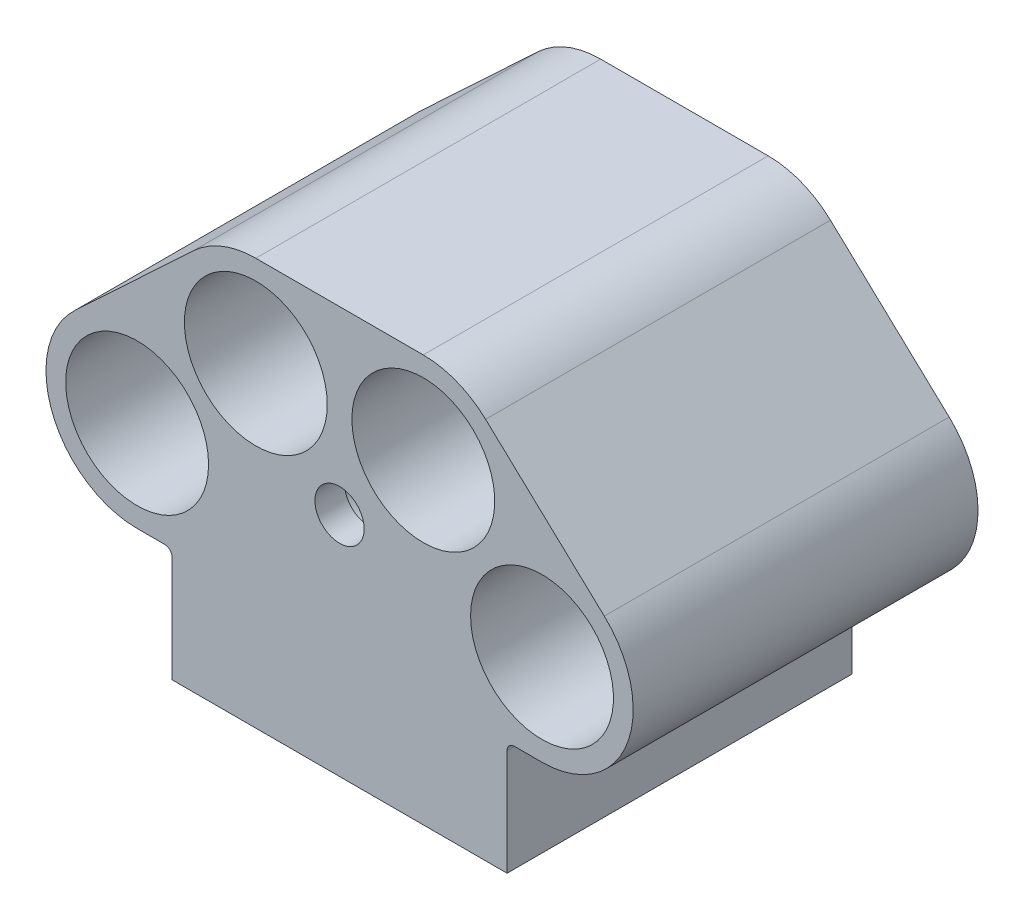
ISO-10303-21;
HEADER;
FILE_DESCRIPTION(('STEP AP214'),'2;1');
FILE_NAME('part.step','',(''),(''),'','','');
FILE_SCHEMA(('AUTOMOTIVE_DESIGN { 1 0 10303 214 1 1 1 1 }'));
ENDSEC;
DATA;
#1=APPLICATION_CONTEXT('core data for automotive mechanical design processes');
#2=APPLICATION_PROTOCOL_DEFINITION('international standard','automotive_design',2000,#1);
#3=PRODUCT_CONTEXT('',#1,'mechanical');
#4=PRODUCT('Part','Part','',(#3));
#5=PRODUCT_RELATED_PRODUCT_CATEGORY('part','',(#4));
#6=PRODUCT_DEFINITION_FORMATION('','',#4);
#7=PRODUCT_DEFINITION_CONTEXT('part definition',#1,'design');
#8=PRODUCT_DEFINITION('design','',#6,#7);
#9=PRODUCT_DEFINITION_SHAPE('','',#8);
#10=(LENGTH_UNIT() NAMED_UNIT(*) SI_UNIT(.MILLI.,.METRE.));
#11=(NAMED_UNIT(*) PLANE_ANGLE_UNIT() SI_UNIT($,.RADIAN.));
#12=(NAMED_UNIT(*) SI_UNIT($,.STERADIAN.) SOLID_ANGLE_UNIT());
#13=UNCERTAINTY_MEASURE_WITH_UNIT(LENGTH_MEASURE(1.E-05),#10,'distance_accuracy_value','');
#14=(GEOMETRIC_REPRESENTATION_CONTEXT(3) GLOBAL_UNCERTAINTY_ASSIGNED_CONTEXT((#13)) GLOBAL_UNIT_ASSIGNED_CONTEXT((#10,
#11,#12)) REPRESENTATION_CONTEXT('',''));
#15=CARTESIAN_POINT('',(0.,0.,0.));
#16=DIRECTION('',(0.,0.,1.));
#17=DIRECTION('',(1.,0.,0.));
#18=AXIS2_PLACEMENT_3D('',#15,#16,#17);
#19=CARTESIAN_POINT('',(0.,21.,17.5));
#20=DIRECTION('',(0.,0.,-1.));
#21=DIRECTION('',(-1.,0.,0.));
#22=AXIS2_PLACEMENT_3D('',#19,#20,#21);
#23=CYLINDRICAL_SURFACE('',#22,2.5);
#24=CARTESIAN_POINT('',(0.,21.,14.5));
#25=DIRECTION('',(0.,0.,1.));
#26=DIRECTION('',(1.,0.,0.));
#27=AXIS2_PLACEMENT_3D('',#24,#25,#26);
#28=CIRCLE('',#27,2.5);
#29=CARTESIAN_POINT('',(2.5,21.,14.5));
#30=VERTEX_POINT('',#29);
#31=EDGE_CURVE('E47',#30,#30,#28,.F.);
#32=ORIENTED_EDGE('',*,*,#31,.T.);
#33=EDGE_LOOP('',(#32));
#34=FACE_BOUND('',#33,.T.);
#35=CARTESIAN_POINT('',(0.,21.,17.5));
#36=DIRECTION('',(0.,0.,-1.));
#37=DIRECTION('',(-1.,0.,0.));
#38=AXIS2_PLACEMENT_3D('',#35,#36,#37);
#39=CIRCLE('',#38,2.5);
#40=CARTESIAN_POINT('',(-2.5,21.,17.5));
#41=VERTEX_POINT('',#40);
#42=EDGE_CURVE('E223',#41,#41,#39,.T.);
#43=ORIENTED_EDGE('',*,*,#42,.F.);
#44=EDGE_LOOP('',(#43));
#45=FACE_BOUND('',#44,.T.);
#46=ADVANCED_FACE('F43',(#34,#45),#23,.F.);
#47=CARTESIAN_POINT('',(-20.5457096935437,18.7783967620276,17.5));
#48=DIRECTION('',(0.,0.,-1.));
#49=DIRECTION('',(-1.,0.,0.));
#50=AXIS2_PLACEMENT_3D('',#47,#48,#49);
#51=CYLINDRICAL_SURFACE('',#50,9.25);
#52=CARTESIAN_POINT('',(-20.5457096935437,18.7783967620276,-17.5));
#53=DIRECTION('',(0.,0.,1.));
#54=DIRECTION('',(1.,0.,0.));
#55=AXIS2_PLACEMENT_3D('',#52,#53,#54);
#56=CIRCLE('',#55,9.25);
#57=CARTESIAN_POINT('',(-20.5457096935437,9.52839676202764,-17.5));
#58=VERTEX_POINT('',#57);
#59=CARTESIAN_POINT('',(-26.8671707993832,25.5312946205294,-17.5));
#60=VERTEX_POINT('',#59);
#61=EDGE_CURVE('E156',#58,#60,#56,.F.);
#62=ORIENTED_EDGE('',*,*,#61,.F.);
#63=DIRECTION('',(0.,0.,-1.));
#64=VECTOR('',#63,1.);
#65=CARTESIAN_POINT('',(-20.5457096935437,9.52839676202764,17.5));
#66=LINE('',#65,#64);
#67=CARTESIAN_POINT('',(-20.5457096935437,9.52839676202764,17.5));
#68=VERTEX_POINT('',#67);
#69=EDGE_CURVE('E12',#68,#58,#66,.T.);
#70=ORIENTED_EDGE('',*,*,#69,.F.);
#71=CARTESIAN_POINT('',(-20.5457096935437,18.7783967620276,17.5));
#72=DIRECTION('',(0.,0.,1.));
#73=DIRECTION('',(1.,0.,0.));
#74=AXIS2_PLACEMENT_3D('',#71,#72,#73);
#75=CIRCLE('',#74,9.25);
#76=CARTESIAN_POINT('',(-26.8671707993832,25.5312946205294,17.5));
#77=VERTEX_POINT('',#76);
#78=EDGE_CURVE('E190',#68,#77,#75,.F.);
#79=ORIENTED_EDGE('',*,*,#78,.T.);
#80=DIRECTION('',(0.,0.,-1.));
#81=VECTOR('',#80,1.);
#82=CARTESIAN_POINT('',(-26.8671707993832,25.5312946205294,17.5));
#83=LINE('',#82,#81);
#84=EDGE_CURVE('E63',#77,#60,#83,.T.);
#85=ORIENTED_EDGE('',*,*,#84,.T.);
#86=EDGE_LOOP('',(#62,#70,#79,#85));
#87=FACE_BOUND('',#86,.T.);
#88=ADVANCED_FACE('F45',(#87),#51,.T.);
#89=CARTESIAN_POINT('',(0.,9.52839676202764,17.5));
#90=DIRECTION('',(0.,1.,0.));
#91=DIRECTION('',(0.,0.,1.));
#92=AXIS2_PLACEMENT_3D('',#89,#90,#91);
#93=PLANE('',#92);
#94=DIRECTION('',(1.,0.,0.));
#95=VECTOR('',#94,1.);
#96=CARTESIAN_POINT('',(0.,9.52839676202764,-17.5));
#97=LINE('',#96,#95);
#98=CARTESIAN_POINT('',(-17.75,9.52839676202764,-17.5));
#99=VERTEX_POINT('',#98);
#100=EDGE_CURVE('E159',#58,#99,#97,.T.);
#101=ORIENTED_EDGE('',*,*,#100,.T.);
#102=DIRECTION('',(0.,0.,-1.));
#103=VECTOR('',#102,1.);
#104=CARTESIAN_POINT('',(-17.75,9.52839676202764,17.5));
#105=LINE('',#104,#103);
#106=CARTESIAN_POINT('',(-17.75,9.52839676202764,17.5));
#107=VERTEX_POINT('',#106);
#108=EDGE_CURVE('E54',#107,#99,#105,.T.);
#109=ORIENTED_EDGE('',*,*,#108,.F.);
#110=DIRECTION('',(1.,0.,0.));
#111=VECTOR('',#110,1.);
#112=CARTESIAN_POINT('',(0.,9.52839676202764,17.5));
#113=LINE('',#112,#111);
#114=EDGE_CURVE('E319',#68,#107,#113,.T.);
#115=ORIENTED_EDGE('',*,*,#114,.F.);
#116=ORIENTED_EDGE('',*,*,#69,.T.);
#117=EDGE_LOOP('',(#101,#109,#115,#116));
#118=FACE_BOUND('',#117,.T.);
#119=ADVANCED_FACE('F412',(#118),#93,.F.);
#120=CARTESIAN_POINT('',(-17.75,8.77839676202764,17.5));
#121=DIRECTION('',(0.,0.,-1.));
#122=DIRECTION('',(-1.,0.,0.));
#123=AXIS2_PLACEMENT_3D('',#120,#121,#122);
#124=CYLINDRICAL_SURFACE('',#123,0.750000000000001);
#125=CARTESIAN_POINT('',(-17.75,8.77839676202764,-17.5));
#126=DIRECTION('',(0.,0.,1.));
#127=DIRECTION('',(1.,0.,0.));
#128=AXIS2_PLACEMENT_3D('',#125,#126,#127);
#129=CIRCLE('',#128,0.750000000000001);
#130=CARTESIAN_POINT('',(-17.,8.77839676202764,-17.5));
#131=VERTEX_POINT('',#130);
#132=EDGE_CURVE('E163',#99,#131,#129,.F.);
#133=ORIENTED_EDGE('',*,*,#132,.T.);
#134=DIRECTION('',(0.,0.,-1.));
#135=VECTOR('',#134,1.);
#136=CARTESIAN_POINT('',(-17.,8.77839676202764,17.5));
#137=LINE('',#136,#135);
#138=CARTESIAN_POINT('',(-17.,8.77839676202764,17.5));
#139=VERTEX_POINT('',#138);
#140=EDGE_CURVE('E198',#139,#131,#137,.T.);
#141=ORIENTED_EDGE('',*,*,#140,.F.);
#142=CARTESIAN_POINT('',(-17.75,8.77839676202764,17.5));
#143=DIRECTION('',(0.,0.,1.));
#144=DIRECTION('',(1.,0.,0.));
#145=AXIS2_PLACEMENT_3D('',#142,#143,#144);
#146=CIRCLE('',#145,0.750000000000001);
#147=EDGE_CURVE('E322',#107,#139,#146,.F.);
#148=ORIENTED_EDGE('',*,*,#147,.F.);
#149=ORIENTED_EDGE('',*,*,#108,.T.);
#150=EDGE_LOOP('',(#133,#141,#148,#149));
#151=FACE_BOUND('',#150,.T.);
#152=ADVANCED_FACE('F606',(#151),#124,.F.);
#153=CARTESIAN_POINT('',(-17.,0.,17.5));
#154=DIRECTION('',(1.,0.,0.));
#155=DIRECTION('',(0.,0.,-1.));
#156=AXIS2_PLACEMENT_3D('',#153,#154,#155);
#157=PLANE('',#156);
#158=DIRECTION('',(0.,-1.,0.));
#159=VECTOR('',#158,1.);
#160=CARTESIAN_POINT('',(-17.,0.,-17.5));
#161=LINE('',#160,#159);
#162=CARTESIAN_POINT('',(-17.,-2.,-17.5));
#163=VERTEX_POINT('',#162);
#164=EDGE_CURVE('E166',#131,#163,#161,.T.);
#165=ORIENTED_EDGE('',*,*,#164,.T.);
#166=DIRECTION('',(0.,0.,-1.));
#167=VECTOR('',#166,1.);
#168=CARTESIAN_POINT('',(-17.,-2.,17.5));
#169=LINE('',#168,#167);
#170=CARTESIAN_POINT('',(-17.,-2.,17.5));
#171=VERTEX_POINT('',#170);
#172=EDGE_CURVE('E124',#171,#163,#169,.T.);
#173=ORIENTED_EDGE('',*,*,#172,.F.);
#174=DIRECTION('',(0.,-1.,0.));
#175=VECTOR('',#174,1.);
#176=CARTESIAN_POINT('',(-17.,0.,17.5));
#177=LINE('',#176,#175);
#178=EDGE_CURVE('E325',#139,#171,#177,.T.);
#179=ORIENTED_EDGE('',*,*,#178,.F.);
#180=ORIENTED_EDGE('',*,*,#140,.T.);
#181=EDGE_LOOP('',(#165,#173,#179,#180));
#182=FACE_BOUND('',#181,.T.);
#183=ADVANCED_FACE('F574',(#182),#157,.F.);
#184=CARTESIAN_POINT('',(0.,-2.,17.5));
#185=DIRECTION('',(0.,1.,0.));
#186=DIRECTION('',(0.,0.,1.));
#187=AXIS2_PLACEMENT_3D('',#184,#185,#186);
#188=PLANE('',#187);
#189=DIRECTION('',(1.,0.,0.));
#190=VECTOR('',#189,1.);
#191=CARTESIAN_POINT('',(0.,-2.,-17.5));
#192=LINE('',#191,#190);
#193=CARTESIAN_POINT('',(17.,-2.,-17.5));
#194=VERTEX_POINT('',#193);
#195=EDGE_CURVE('E169',#163,#194,#192,.T.);
#196=ORIENTED_EDGE('',*,*,#195,.T.);
#197=DIRECTION('',(0.,0.,-1.));
#198=VECTOR('',#197,1.);
#199=CARTESIAN_POINT('',(17.,-2.,17.5));
#200=LINE('',#199,#198);
#201=CARTESIAN_POINT('',(17.,-2.,17.5));
#202=VERTEX_POINT('',#201);
#203=EDGE_CURVE('E303',#202,#194,#200,.T.);
#204=ORIENTED_EDGE('',*,*,#203,.F.);
#205=DIRECTION('',(1.,0.,0.));
#206=VECTOR('',#205,1.);
#207=CARTESIAN_POINT('',(0.,-2.,17.5));
#208=LINE('',#207,#206);
#209=EDGE_CURVE('E138',#171,#202,#208,.T.);
#210=ORIENTED_EDGE('',*,*,#209,.F.);
#211=ORIENTED_EDGE('',*,*,#172,.T.);
#212=EDGE_LOOP('',(#196,#204,#210,#211));
#213=FACE_BOUND('',#212,.T.);
#214=ADVANCED_FACE('F339',(#213),#188,.F.);
#215=CARTESIAN_POINT('',(0.,39.3045165724442,17.5));
#216=DIRECTION('',(0.,1.,0.));
#217=DIRECTION('',(0.,0.,1.));
#218=AXIS2_PLACEMENT_3D('',#215,#216,#217);
#219=PLANE('',#218);
#220=DIRECTION('',(1.,0.,0.));
#221=VECTOR('',#220,1.);
#222=CARTESIAN_POINT('',(0.,39.3045165724442,-17.5));
#223=LINE('',#222,#221);
#224=CARTESIAN_POINT('',(-8.5,39.3045165724442,-17.5));
#225=VERTEX_POINT('',#224);
#226=CARTESIAN_POINT('',(8.5,39.3045165724442,-17.5));
#227=VERTEX_POINT('',#226);
#228=EDGE_CURVE('E119',#225,#227,#223,.T.);
#229=ORIENTED_EDGE('',*,*,#228,.F.);
#230=DIRECTION('',(0.,0.,-1.));
#231=VECTOR('',#230,1.);
#232=CARTESIAN_POINT('',(-8.5,39.3045165724442,17.5));
#233=LINE('',#232,#231);
#234=CARTESIAN_POINT('',(-8.5,39.3045165724442,17.5));
#235=VERTEX_POINT('',#234);
#236=EDGE_CURVE('E111',#235,#225,#233,.T.);
#237=ORIENTED_EDGE('',*,*,#236,.F.);
#238=DIRECTION('',(1.,0.,0.));
#239=VECTOR('',#238,1.);
#240=CARTESIAN_POINT('',(0.,39.3045165724442,17.5));
#241=LINE('',#240,#239);
#242=CARTESIAN_POINT('',(8.5,39.3045165724442,17.5));
#243=VERTEX_POINT('',#242);
#244=EDGE_CURVE('E116',#235,#243,#241,.T.);
#245=ORIENTED_EDGE('',*,*,#244,.T.);
#246=DIRECTION('',(0.,0.,-1.));
#247=VECTOR('',#246,1.);
#248=CARTESIAN_POINT('',(8.5,39.3045165724442,17.5));
#249=LINE('',#248,#247);
#250=EDGE_CURVE('E307',#243,#227,#249,.T.);
#251=ORIENTED_EDGE('',*,*,#250,.T.);
#252=EDGE_LOOP('',(#229,#237,#245,#251));
#253=FACE_BOUND('',#252,.T.);
#254=ADVANCED_FACE('F113',(#253),#219,.T.);
#255=CARTESIAN_POINT('',(-8.5,30.0545165724442,17.5));
#256=DIRECTION('',(0.,0.,-1.));
#257=DIRECTION('',(-1.,0.,0.));
#258=AXIS2_PLACEMENT_3D('',#255,#256,#257);
#259=CYLINDRICAL_SURFACE('',#258,9.25);
#260=CARTESIAN_POINT('',(-8.5,30.0545165724442,-17.5));
#261=DIRECTION('',(0.,0.,1.));
#262=DIRECTION('',(1.,0.,0.));
#263=AXIS2_PLACEMENT_3D('',#260,#261,#262);
#264=CIRCLE('',#263,9.25);
#265=CARTESIAN_POINT('',(-14.8214611058396,36.8074144309459,-17.5));
#266=VERTEX_POINT('',#265);
#267=EDGE_CURVE('E175',#266,#225,#264,.F.);
#268=ORIENTED_EDGE('',*,*,#267,.F.);
#269=DIRECTION('',(0.,0.,-1.));
#270=VECTOR('',#269,1.);
#271=CARTESIAN_POINT('',(-14.8214611058396,36.8074144309459,17.5));
#272=LINE('',#271,#270);
#273=CARTESIAN_POINT('',(-14.8214611058396,36.8074144309459,17.5));
#274=VERTEX_POINT('',#273);
#275=EDGE_CURVE('E86',#274,#266,#272,.T.);
#276=ORIENTED_EDGE('',*,*,#275,.F.);
#277=CARTESIAN_POINT('',(-8.5,30.0545165724442,17.5));
#278=DIRECTION('',(0.,0.,1.));
#279=DIRECTION('',(1.,0.,0.));
#280=AXIS2_PLACEMENT_3D('',#277,#278,#279);
#281=CIRCLE('',#280,9.25);
#282=EDGE_CURVE('E132',#274,#235,#281,.F.);
#283=ORIENTED_EDGE('',*,*,#282,.T.);
#284=ORIENTED_EDGE('',*,*,#236,.T.);
#285=EDGE_LOOP('',(#268,#276,#283,#284));
#286=FACE_BOUND('',#285,.T.);
#287=ADVANCED_FACE('F140',(#286),#259,.T.);
#288=CARTESIAN_POINT('',(-8.5,30.0545165724442,17.5));
#289=DIRECTION('',(0.,0.,-1.));
#290=DIRECTION('',(-1.,0.,0.));
#291=AXIS2_PLACEMENT_3D('',#288,#289,#290);
#292=CYLINDRICAL_SURFACE('',#291,7.25);
#293=CARTESIAN_POINT('',(-8.5,30.0545165724442,17.5));
#294=DIRECTION('',(0.,0.,1.));
#295=DIRECTION('',(1.,0.,0.));
#296=AXIS2_PLACEMENT_3D('',#293,#294,#295);
#297=CIRCLE('',#296,7.25);
#298=CARTESIAN_POINT('',(-1.25,30.0545165724442,17.5));
#299=VERTEX_POINT('',#298);
#300=EDGE_CURVE('E145',#299,#299,#297,.T.);
#301=ORIENTED_EDGE('',*,*,#300,.T.);
#302=EDGE_LOOP('',(#301));
#303=FACE_BOUND('',#302,.T.);
#304=CARTESIAN_POINT('',(-8.5,30.0545165724442,-17.5));
#305=DIRECTION('',(0.,0.,1.));
#306=DIRECTION('',(1.,0.,0.));
#307=AXIS2_PLACEMENT_3D('',#304,#305,#306);
#308=CIRCLE('',#307,7.25);
#309=CARTESIAN_POINT('',(-1.25,30.0545165724442,-17.5));
#310=VERTEX_POINT('',#309);
#311=EDGE_CURVE('E182',#310,#310,#308,.T.);
#312=ORIENTED_EDGE('',*,*,#311,.F.);
#313=EDGE_LOOP('',(#312));
#314=FACE_BOUND('',#313,.T.);
#315=ADVANCED_FACE('F394',(#303,#314),#292,.F.);
#316=CARTESIAN_POINT('',(-25.2858444233583,27.011591434007,17.5));
#317=DIRECTION('',(-0.683401200631305,0.730043011729919,0.));
#318=DIRECTION('',(-0.730043011729919,-0.683401200631305,0.));
#319=AXIS2_PLACEMENT_3D('',#316,#317,#318);
#320=PLANE('',#319);
#321=DIRECTION('',(0.730043011729919,0.683401200631305,0.));
#322=VECTOR('',#321,1.);
#323=CARTESIAN_POINT('',(-25.2858444233583,27.011591434007,-17.5));
#324=LINE('',#323,#322);
#325=EDGE_CURVE('E178',#60,#266,#324,.T.);
#326=ORIENTED_EDGE('',*,*,#325,.F.);
#327=ORIENTED_EDGE('',*,*,#84,.F.);
#328=DIRECTION('',(0.730043011729919,0.683401200631305,0.));
#329=VECTOR('',#328,1.);
#330=CARTESIAN_POINT('',(-25.2858444233583,27.011591434007,17.5));
#331=LINE('',#330,#329);
#332=EDGE_CURVE('E142',#77,#274,#331,.T.);
#333=ORIENTED_EDGE('',*,*,#332,.T.);
#334=ORIENTED_EDGE('',*,*,#275,.T.);
#335=EDGE_LOOP('',(#326,#327,#333,#334));
#336=FACE_BOUND('',#335,.T.);
#337=ADVANCED_FACE('F391',(#336),#320,.T.);
#338=CARTESIAN_POINT('',(-20.5457096935437,18.7783967620276,17.5));
#339=DIRECTION('',(0.,0.,-1.));
#340=DIRECTION('',(-1.,0.,0.));
#341=AXIS2_PLACEMENT_3D('',#338,#339,#340);
#342=CYLINDRICAL_SURFACE('',#341,7.25);
#343=CARTESIAN_POINT('',(-20.5457096935437,18.7783967620276,17.5));
#344=DIRECTION('',(0.,0.,1.));
#345=DIRECTION('',(1.,0.,0.));
#346=AXIS2_PLACEMENT_3D('',#343,#344,#345);
#347=CIRCLE('',#346,7.25);
#348=CARTESIAN_POINT('',(-13.2957096935437,18.7783967620276,17.5));
#349=VERTEX_POINT('',#348);
#350=EDGE_CURVE('E152',#349,#349,#347,.T.);
#351=ORIENTED_EDGE('',*,*,#350,.T.);
#352=EDGE_LOOP('',(#351));
#353=FACE_BOUND('',#352,.T.);
#354=CARTESIAN_POINT('',(-20.5457096935437,18.7783967620276,-17.5));
#355=DIRECTION('',(0.,0.,1.));
#356=DIRECTION('',(1.,0.,0.));
#357=AXIS2_PLACEMENT_3D('',#354,#355,#356);
#358=CIRCLE('',#357,7.25);
#359=CARTESIAN_POINT('',(-13.2957096935437,18.7783967620276,-17.5));
#360=VERTEX_POINT('',#359);
#361=EDGE_CURVE('E186',#360,#360,#358,.T.);
#362=ORIENTED_EDGE('',*,*,#361,.F.);
#363=EDGE_LOOP('',(#362));
#364=FACE_BOUND('',#363,.T.);
#365=ADVANCED_FACE('F393',(#353,#364),#342,.F.);
#366=CARTESIAN_POINT('',(0.,0.,17.5));
#367=DIRECTION('',(0.,0.,1.));
#368=DIRECTION('',(1.,0.,0.));
#369=AXIS2_PLACEMENT_3D('',#366,#367,#368);
#370=PLANE('',#369);
#371=ORIENTED_EDGE('',*,*,#42,.T.);
#372=EDGE_LOOP('',(#371));
#373=FACE_BOUND('',#372,.T.);
#374=ORIENTED_EDGE('',*,*,#78,.F.);
#375=ORIENTED_EDGE('',*,*,#114,.T.);
#376=ORIENTED_EDGE('',*,*,#147,.T.);
#377=ORIENTED_EDGE('',*,*,#178,.T.);
#378=ORIENTED_EDGE('',*,*,#209,.T.);
#379=DIRECTION('',(0.,-1.,0.));
#380=VECTOR('',#379,1.);
#381=CARTESIAN_POINT('',(17.,0.,17.5));
#382=LINE('',#381,#380);
#383=CARTESIAN_POINT('',(17.,8.77839676202764,17.5));
#384=VERTEX_POINT('',#383);
#385=EDGE_CURVE('E241',#384,#202,#382,.T.);
#386=ORIENTED_EDGE('',*,*,#385,.F.);
#387=CARTESIAN_POINT('',(17.75,8.77839676202764,17.5));
#388=DIRECTION('',(0.,0.,-1.));
#389=DIRECTION('',(-1.,0.,0.));
#390=AXIS2_PLACEMENT_3D('',#387,#388,#389);
#391=CIRCLE('',#390,0.750000000000001);
#392=CARTESIAN_POINT('',(17.75,9.52839676202764,17.5));
#393=VERTEX_POINT('',#392);
#394=EDGE_CURVE('E245',#393,#384,#391,.F.);
#395=ORIENTED_EDGE('',*,*,#394,.F.);
#396=DIRECTION('',(-1.,0.,0.));
#397=VECTOR('',#396,1.);
#398=CARTESIAN_POINT('',(0.,9.52839676202764,17.5));
#399=LINE('',#398,#397);
#400=CARTESIAN_POINT('',(20.5457096935437,9.52839676202764,17.5));
#401=VERTEX_POINT('',#400);
#402=EDGE_CURVE('E249',#401,#393,#399,.T.);
#403=ORIENTED_EDGE('',*,*,#402,.F.);
#404=CARTESIAN_POINT('',(20.5457096935437,18.7783967620276,17.5));
#405=DIRECTION('',(0.,0.,-1.));
#406=DIRECTION('',(-1.,0.,0.));
#407=AXIS2_PLACEMENT_3D('',#404,#405,#406);
#408=CIRCLE('',#407,9.25);
#409=CARTESIAN_POINT('',(26.8671707993832,25.5312946205294,17.5));
#410=VERTEX_POINT('',#409);
#411=EDGE_CURVE('E231',#401,#410,#408,.F.);
#412=ORIENTED_EDGE('',*,*,#411,.T.);
#413=DIRECTION('',(-0.730043011729919,0.683401200631305,0.));
#414=VECTOR('',#413,1.);
#415=CARTESIAN_POINT('',(25.2858444233583,27.011591434007,17.5));
#416=LINE('',#415,#414);
#417=CARTESIAN_POINT('',(14.8214611058396,36.8074144309459,17.5));
#418=VERTEX_POINT('',#417);
#419=EDGE_CURVE('E235',#410,#418,#416,.T.);
#420=ORIENTED_EDGE('',*,*,#419,.T.);
#421=CARTESIAN_POINT('',(8.5,30.0545165724442,17.5));
#422=DIRECTION('',(0.,0.,-1.));
#423=DIRECTION('',(-1.,0.,0.));
#424=AXIS2_PLACEMENT_3D('',#421,#422,#423);
#425=CIRCLE('',#424,9.25);
#426=EDGE_CURVE('E135',#418,#243,#425,.F.);
#427=ORIENTED_EDGE('',*,*,#426,.T.);
#428=ORIENTED_EDGE('',*,*,#244,.F.);
#429=ORIENTED_EDGE('',*,*,#282,.F.);
#430=ORIENTED_EDGE('',*,*,#332,.F.);
#431=EDGE_LOOP('',(#374,#375,#376,#377,#378,#386,#395,#403,#412,#420,#427,#428,#429,#430));
#432=FACE_BOUND('',#431,.T.);
#433=ORIENTED_EDGE('',*,*,#300,.F.);
#434=EDGE_LOOP('',(#433));
#435=FACE_BOUND('',#434,.T.);
#436=ORIENTED_EDGE('',*,*,#350,.F.);
#437=EDGE_LOOP('',(#436));
#438=FACE_BOUND('',#437,.T.);
#439=CARTESIAN_POINT('',(8.5,30.0545165724442,17.5));
#440=DIRECTION('',(0.,0.,-1.));
#441=DIRECTION('',(-1.,0.,0.));
#442=AXIS2_PLACEMENT_3D('',#439,#440,#441);
#443=CIRCLE('',#442,7.25);
#444=CARTESIAN_POINT('',(1.25,30.0545165724442,17.5));
#445=VERTEX_POINT('',#444);
#446=EDGE_CURVE('E253',#445,#445,#443,.T.);
#447=ORIENTED_EDGE('',*,*,#446,.T.);
#448=EDGE_LOOP('',(#447));
#449=FACE_BOUND('',#448,.T.);
#450=CARTESIAN_POINT('',(20.5457096935437,18.7783967620276,17.5));
#451=DIRECTION('',(0.,0.,-1.));
#452=DIRECTION('',(-1.,0.,0.));
#453=AXIS2_PLACEMENT_3D('',#450,#451,#452);
#454=CIRCLE('',#453,7.25);
#455=CARTESIAN_POINT('',(13.2957096935437,18.7783967620276,17.5));
#456=VERTEX_POINT('',#455);
#457=EDGE_CURVE('E257',#456,#456,#454,.T.);
#458=ORIENTED_EDGE('',*,*,#457,.T.);
#459=EDGE_LOOP('',(#458));
#460=FACE_BOUND('',#459,.T.);
#461=ADVANCED_FACE('F129',(#373,#432,#435,#438,#449,#460),#370,.T.);
#462=CARTESIAN_POINT('',(0.,0.,-17.5));
#463=DIRECTION('',(0.,0.,1.));
#464=DIRECTION('',(1.,0.,0.));
#465=AXIS2_PLACEMENT_3D('',#462,#463,#464);
#466=PLANE('',#465);
#467=CARTESIAN_POINT('',(0.,21.,-17.5));
#468=DIRECTION('',(0.,0.,-1.));
#469=DIRECTION('',(-1.,0.,0.));
#470=AXIS2_PLACEMENT_3D('',#467,#468,#469);
#471=CIRCLE('',#470,2.5);
#472=CARTESIAN_POINT('',(-2.5,21.,-17.5));
#473=VERTEX_POINT('',#472);
#474=EDGE_CURVE('E213',#473,#473,#471,.T.);
#475=ORIENTED_EDGE('',*,*,#474,.F.);
#476=EDGE_LOOP('',(#475));
#477=FACE_BOUND('',#476,.T.);
#478=ORIENTED_EDGE('',*,*,#61,.T.);
#479=ORIENTED_EDGE('',*,*,#325,.T.);
#480=ORIENTED_EDGE('',*,*,#267,.T.);
#481=ORIENTED_EDGE('',*,*,#228,.T.);
#482=CARTESIAN_POINT('',(8.5,30.0545165724442,-17.5));
#483=DIRECTION('',(0.,0.,-1.));
#484=DIRECTION('',(-1.,0.,0.));
#485=AXIS2_PLACEMENT_3D('',#482,#483,#484);
#486=CIRCLE('',#485,9.25);
#487=CARTESIAN_POINT('',(14.8214611058396,36.8074144309459,-17.5));
#488=VERTEX_POINT('',#487);
#489=EDGE_CURVE('E269',#488,#227,#486,.F.);
#490=ORIENTED_EDGE('',*,*,#489,.F.);
#491=DIRECTION('',(-0.730043011729919,0.683401200631305,0.));
#492=VECTOR('',#491,1.);
#493=CARTESIAN_POINT('',(25.2858444233583,27.011591434007,-17.5));
#494=LINE('',#493,#492);
#495=CARTESIAN_POINT('',(26.8671707993832,25.5312946205294,-17.5));
#496=VERTEX_POINT('',#495);
#497=EDGE_CURVE('E265',#496,#488,#494,.T.);
#498=ORIENTED_EDGE('',*,*,#497,.F.);
#499=CARTESIAN_POINT('',(20.5457096935437,18.7783967620276,-17.5));
#500=DIRECTION('',(0.,0.,-1.));
#501=DIRECTION('',(-1.,0.,0.));
#502=AXIS2_PLACEMENT_3D('',#499,#500,#501);
#503=CIRCLE('',#502,9.25);
#504=CARTESIAN_POINT('',(20.5457096935437,9.52839676202764,-17.5));
#505=VERTEX_POINT('',#504);
#506=EDGE_CURVE('E227',#505,#496,#503,.F.);
#507=ORIENTED_EDGE('',*,*,#506,.F.);
#508=DIRECTION('',(-1.,0.,0.));
#509=VECTOR('',#508,1.);
#510=CARTESIAN_POINT('',(0.,9.52839676202764,-17.5));
#511=LINE('',#510,#509);
#512=CARTESIAN_POINT('',(17.75,9.52839676202764,-17.5));
#513=VERTEX_POINT('',#512);
#514=EDGE_CURVE('E281',#505,#513,#511,.T.);
#515=ORIENTED_EDGE('',*,*,#514,.T.);
#516=CARTESIAN_POINT('',(17.75,8.77839676202764,-17.5));
#517=DIRECTION('',(0.,0.,-1.));
#518=DIRECTION('',(-1.,0.,0.));
#519=AXIS2_PLACEMENT_3D('',#516,#517,#518);
#520=CIRCLE('',#519,0.750000000000001);
#521=CARTESIAN_POINT('',(17.,8.77839676202764,-17.5));
#522=VERTEX_POINT('',#521);
#523=EDGE_CURVE('E277',#513,#522,#520,.F.);
#524=ORIENTED_EDGE('',*,*,#523,.T.);
#525=DIRECTION('',(0.,-1.,0.));
#526=VECTOR('',#525,1.);
#527=CARTESIAN_POINT('',(17.,0.,-17.5));
#528=LINE('',#527,#526);
#529=EDGE_CURVE('E273',#522,#194,#528,.T.);
#530=ORIENTED_EDGE('',*,*,#529,.T.);
#531=ORIENTED_EDGE('',*,*,#195,.F.);
#532=ORIENTED_EDGE('',*,*,#164,.F.);
#533=ORIENTED_EDGE('',*,*,#132,.F.);
#534=ORIENTED_EDGE('',*,*,#100,.F.);
#535=EDGE_LOOP('',(#478,#479,#480,#481,#490,#498,#507,#515,#524,#530,#531,#532,#533,#534));
#536=FACE_BOUND('',#535,.T.);
#537=ORIENTED_EDGE('',*,*,#311,.T.);
#538=EDGE_LOOP('',(#537));
#539=FACE_BOUND('',#538,.T.);
#540=ORIENTED_EDGE('',*,*,#361,.T.);
#541=EDGE_LOOP('',(#540));
#542=FACE_BOUND('',#541,.T.);
#543=CARTESIAN_POINT('',(8.5,30.0545165724442,-17.5));
#544=DIRECTION('',(0.,0.,-1.));
#545=DIRECTION('',(-1.,0.,0.));
#546=AXIS2_PLACEMENT_3D('',#543,#544,#545);
#547=CIRCLE('',#546,7.25);
#548=CARTESIAN_POINT('',(1.25,30.0545165724442,-17.5));
#549=VERTEX_POINT('',#548);
#550=EDGE_CURVE('E285',#549,#549,#547,.T.);
#551=ORIENTED_EDGE('',*,*,#550,.F.);
#552=EDGE_LOOP('',(#551));
#553=FACE_BOUND('',#552,.T.);
#554=CARTESIAN_POINT('',(20.5457096935437,18.7783967620276,-17.5));
#555=DIRECTION('',(0.,0.,-1.));
#556=DIRECTION('',(-1.,0.,0.));
#557=AXIS2_PLACEMENT_3D('',#554,#555,#556);
#558=CIRCLE('',#557,7.25);
#559=CARTESIAN_POINT('',(13.2957096935437,18.7783967620276,-17.5));
#560=VERTEX_POINT('',#559);
#561=EDGE_CURVE('E236',#560,#560,#558,.T.);
#562=ORIENTED_EDGE('',*,*,#561,.F.);
#563=EDGE_LOOP('',(#562));
#564=FACE_BOUND('',#563,.T.);
#565=ADVANCED_FACE('F383',(#477,#536,#539,#542,#553,#564),#466,.F.);
#566=CARTESIAN_POINT('',(20.5457096935437,18.7783967620276,17.5));
#567=DIRECTION('',(0.,0.,-1.));
#568=DIRECTION('',(-1.,0.,0.));
#569=AXIS2_PLACEMENT_3D('',#566,#567,#568);
#570=CYLINDRICAL_SURFACE('',#569,9.25);
#571=ORIENTED_EDGE('',*,*,#506,.T.);
#572=DIRECTION('',(0.,0.,-1.));
#573=VECTOR('',#572,1.);
#574=CARTESIAN_POINT('',(26.8671707993832,25.5312946205294,17.5));
#575=LINE('',#574,#573);
#576=EDGE_CURVE('E160',#410,#496,#575,.T.);
#577=ORIENTED_EDGE('',*,*,#576,.F.);
#578=ORIENTED_EDGE('',*,*,#411,.F.);
#579=DIRECTION('',(0.,0.,-1.));
#580=VECTOR('',#579,1.);
#581=CARTESIAN_POINT('',(20.5457096935437,9.52839676202764,17.5));
#582=LINE('',#581,#580);
#583=EDGE_CURVE('E261',#401,#505,#582,.T.);
#584=ORIENTED_EDGE('',*,*,#583,.T.);
#585=EDGE_LOOP('',(#571,#577,#578,#584));
#586=FACE_BOUND('',#585,.T.);
#587=ADVANCED_FACE('F377',(#586),#570,.T.);
#588=CARTESIAN_POINT('',(25.2858444233583,27.011591434007,17.5));
#589=DIRECTION('',(-0.683401200631305,-0.730043011729919,0.));
#590=DIRECTION('',(0.730043011729919,-0.683401200631305,0.));
#591=AXIS2_PLACEMENT_3D('',#588,#589,#590);
#592=PLANE('',#591);
#593=ORIENTED_EDGE('',*,*,#497,.T.);
#594=DIRECTION('',(0.,0.,-1.));
#595=VECTOR('',#594,1.);
#596=CARTESIAN_POINT('',(14.8214611058396,36.8074144309459,17.5));
#597=LINE('',#596,#595);
#598=EDGE_CURVE('E310',#418,#488,#597,.T.);
#599=ORIENTED_EDGE('',*,*,#598,.F.);
#600=ORIENTED_EDGE('',*,*,#419,.F.);
#601=ORIENTED_EDGE('',*,*,#576,.T.);
#602=EDGE_LOOP('',(#593,#599,#600,#601));
#603=FACE_BOUND('',#602,.T.);
#604=ADVANCED_FACE('F387',(#603),#592,.F.);
#605=CARTESIAN_POINT('',(8.5,30.0545165724442,17.5));
#606=DIRECTION('',(0.,0.,-1.));
#607=DIRECTION('',(-1.,0.,0.));
#608=AXIS2_PLACEMENT_3D('',#605,#606,#607);
#609=CYLINDRICAL_SURFACE('',#608,9.25);
#610=ORIENTED_EDGE('',*,*,#489,.T.);
#611=ORIENTED_EDGE('',*,*,#250,.F.);
#612=ORIENTED_EDGE('',*,*,#426,.F.);
#613=ORIENTED_EDGE('',*,*,#598,.T.);
#614=EDGE_LOOP('',(#610,#611,#612,#613));
#615=FACE_BOUND('',#614,.T.);
#616=ADVANCED_FACE('F389',(#615),#609,.T.);
#617=CARTESIAN_POINT('',(17.,0.,17.5));
#618=DIRECTION('',(1.,0.,0.));
#619=DIRECTION('',(0.,0.,-1.));
#620=AXIS2_PLACEMENT_3D('',#617,#618,#619);
#621=PLANE('',#620);
#622=ORIENTED_EDGE('',*,*,#529,.F.);
#623=DIRECTION('',(0.,0.,-1.));
#624=VECTOR('',#623,1.);
#625=CARTESIAN_POINT('',(17.,8.77839676202764,17.5));
#626=LINE('',#625,#624);
#627=EDGE_CURVE('E299',#384,#522,#626,.T.);
#628=ORIENTED_EDGE('',*,*,#627,.F.);
#629=ORIENTED_EDGE('',*,*,#385,.T.);
#630=ORIENTED_EDGE('',*,*,#203,.T.);
#631=EDGE_LOOP('',(#622,#628,#629,#630));
#632=FACE_BOUND('',#631,.T.);
#633=ADVANCED_FACE('F345',(#632),#621,.T.);
#634=CARTESIAN_POINT('',(17.75,8.77839676202764,17.5));
#635=DIRECTION('',(0.,0.,-1.));
#636=DIRECTION('',(-1.,0.,0.));
#637=AXIS2_PLACEMENT_3D('',#634,#635,#636);
#638=CYLINDRICAL_SURFACE('',#637,0.750000000000001);
#639=ORIENTED_EDGE('',*,*,#523,.F.);
#640=DIRECTION('',(0.,0.,-1.));
#641=VECTOR('',#640,1.);
#642=CARTESIAN_POINT('',(17.75,9.52839676202764,17.5));
#643=LINE('',#642,#641);
#644=EDGE_CURVE('E295',#393,#513,#643,.T.);
#645=ORIENTED_EDGE('',*,*,#644,.F.);
#646=ORIENTED_EDGE('',*,*,#394,.T.);
#647=ORIENTED_EDGE('',*,*,#627,.T.);
#648=EDGE_LOOP('',(#639,#645,#646,#647));
#649=FACE_BOUND('',#648,.T.);
#650=ADVANCED_FACE('F351',(#649),#638,.F.);
#651=CARTESIAN_POINT('',(8.5,30.0545165724442,17.5));
#652=DIRECTION('',(0.,0.,-1.));
#653=DIRECTION('',(-1.,0.,0.));
#654=AXIS2_PLACEMENT_3D('',#651,#652,#653);
#655=CYLINDRICAL_SURFACE('',#654,7.25);
#656=ORIENTED_EDGE('',*,*,#446,.F.);
#657=EDGE_LOOP('',(#656));
#658=FACE_BOUND('',#657,.T.);
#659=ORIENTED_EDGE('',*,*,#550,.T.);
#660=EDGE_LOOP('',(#659));
#661=FACE_BOUND('',#660,.T.);
#662=ADVANCED_FACE('F446',(#658,#661),#655,.F.);
#663=CARTESIAN_POINT('',(0.,9.52839676202764,17.5));
#664=DIRECTION('',(0.,-1.,0.));
#665=DIRECTION('',(0.,0.,-1.));
#666=AXIS2_PLACEMENT_3D('',#663,#664,#665);
#667=PLANE('',#666);
#668=ORIENTED_EDGE('',*,*,#514,.F.);
#669=ORIENTED_EDGE('',*,*,#583,.F.);
#670=ORIENTED_EDGE('',*,*,#402,.T.);
#671=ORIENTED_EDGE('',*,*,#644,.T.);
#672=EDGE_LOOP('',(#668,#669,#670,#671));
#673=FACE_BOUND('',#672,.T.);
#674=ADVANCED_FACE('F386',(#673),#667,.T.);
#675=CARTESIAN_POINT('',(20.5457096935437,18.7783967620276,17.5));
#676=DIRECTION('',(0.,0.,-1.));
#677=DIRECTION('',(-1.,0.,0.));
#678=AXIS2_PLACEMENT_3D('',#675,#676,#677);
#679=CYLINDRICAL_SURFACE('',#678,7.25);
#680=ORIENTED_EDGE('',*,*,#457,.F.);
#681=EDGE_LOOP('',(#680));
#682=FACE_BOUND('',#681,.T.);
#683=ORIENTED_EDGE('',*,*,#561,.T.);
#684=EDGE_LOOP('',(#683));
#685=FACE_BOUND('',#684,.T.);
#686=ADVANCED_FACE('F418',(#682,#685),#679,.F.);
#687=CARTESIAN_POINT('',(0.,21.,-14.5));
#688=DIRECTION('',(0.,0.,-1.));
#689=DIRECTION('',(-1.,0.,0.));
#690=AXIS2_PLACEMENT_3D('',#687,#688,#689);
#691=CIRCLE('',#690,2.5);
#692=CARTESIAN_POINT('',(-2.5,21.,-14.5));
#693=VERTEX_POINT('',#692);
#694=EDGE_CURVE('E204',#693,#693,#691,.F.);
#695=ORIENTED_EDGE('',*,*,#694,.T.);
#696=EDGE_LOOP('',(#695));
#697=FACE_BOUND('',#696,.T.);
#698=ORIENTED_EDGE('',*,*,#474,.T.);
#699=EDGE_LOOP('',(#698));
#700=FACE_BOUND('',#699,.T.);
#701=ADVANCED_FACE('F408',(#697,#700),#23,.F.);
#702=CARTESIAN_POINT('',(0.,0.,14.5));
#703=DIRECTION('',(0.,0.,1.));
#704=DIRECTION('',(1.,0.,0.));
#705=AXIS2_PLACEMENT_3D('',#702,#703,#704);
#706=PLANE('',#705);
#707=CARTESIAN_POINT('',(0.,21.,14.5));
#708=DIRECTION('',(0.,0.,1.));
#709=DIRECTION('',(1.,0.,0.));
#710=AXIS2_PLACEMENT_3D('',#707,#708,#709);
#711=CIRCLE('',#710,4.);
#712=CARTESIAN_POINT('',(4.,21.,14.5));
#713=VERTEX_POINT('',#712);
#714=EDGE_CURVE('E207',#713,#713,#711,.F.);
#715=ORIENTED_EDGE('',*,*,#714,.T.);
#716=EDGE_LOOP('',(#715));
#717=FACE_BOUND('',#716,.T.);
#718=ORIENTED_EDGE('',*,*,#31,.F.);
#719=EDGE_LOOP('',(#718));
#720=FACE_BOUND('',#719,.T.);
#721=ADVANCED_FACE('F417',(#717,#720),#706,.F.);
#722=CARTESIAN_POINT('',(0.,21.,-14.5));
#723=DIRECTION('',(0.,0.,-1.));
#724=DIRECTION('',(-1.,0.,0.));
#725=AXIS2_PLACEMENT_3D('',#722,#723,#724);
#726=PLANE('',#725);
#727=CARTESIAN_POINT('',(0.,21.,-14.5));
#728=DIRECTION('',(0.,0.,-1.));
#729=DIRECTION('',(-1.,0.,0.));
#730=AXIS2_PLACEMENT_3D('',#727,#728,#729);
#731=CIRCLE('',#730,4.);
#732=CARTESIAN_POINT('',(-4.,21.,-14.5));
#733=VERTEX_POINT('',#732);
#734=EDGE_CURVE('E215',#733,#733,#731,.T.);
#735=ORIENTED_EDGE('',*,*,#734,.F.);
#736=EDGE_LOOP('',(#735));
#737=FACE_BOUND('',#736,.T.);
#738=ORIENTED_EDGE('',*,*,#694,.F.);
#739=EDGE_LOOP('',(#738));
#740=FACE_BOUND('',#739,.T.);
#741=ADVANCED_FACE('F423',(#737,#740),#726,.F.);
#742=CARTESIAN_POINT('',(0.,21.,28.8137084989848));
#743=DIRECTION('',(0.,0.,-1.));
#744=DIRECTION('',(-1.,0.,0.));
#745=AXIS2_PLACEMENT_3D('',#742,#743,#744);
#746=CYLINDRICAL_SURFACE('',#745,4.);
#747=ORIENTED_EDGE('',*,*,#734,.T.);
#748=EDGE_LOOP('',(#747));
#749=FACE_BOUND('',#748,.T.);
#750=ORIENTED_EDGE('',*,*,#714,.F.);
#751=EDGE_LOOP('',(#750));
#752=FACE_BOUND('',#751,.T.);
#753=ADVANCED_FACE('F510',(#749,#752),#746,.F.);
#754=CLOSED_SHELL('',(#46,#88,#119,#152,#183,#214,#254,#287,#315,#337,#365,#461,#565,#587,#604,
#616,#633,#650,#662,#674,#686,#701,#721,#741,#753));
#755=MANIFOLD_SOLID_BREP('B2',#754);
#756=ADVANCED_BREP_SHAPE_REPRESENTATION('',(#18,#755),#14);
#757=SHAPE_DEFINITION_REPRESENTATION(#9,#756);
ENDSEC;
END-ISO-10303-21;
